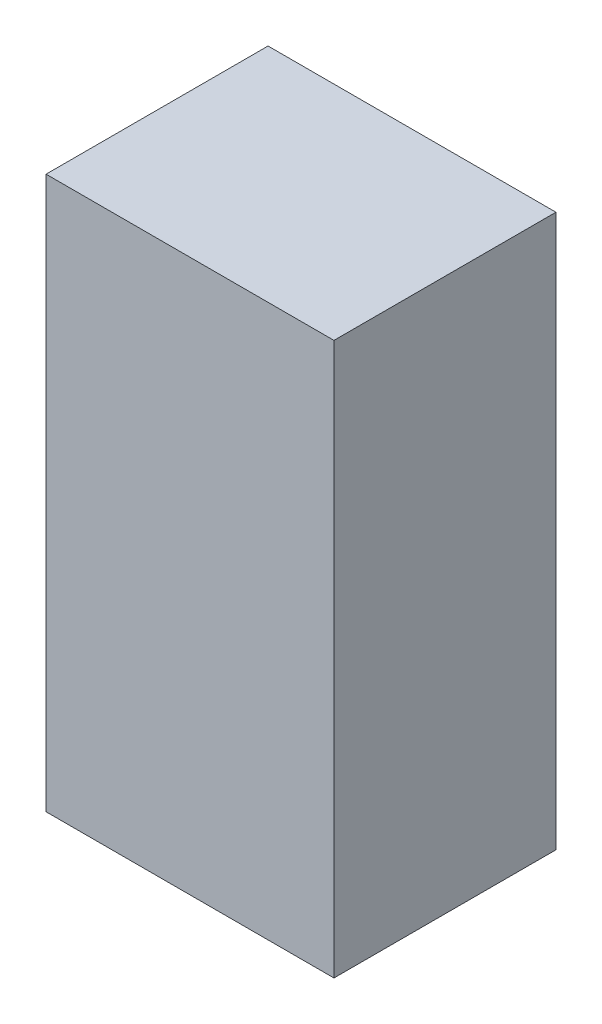
ISO-10303-21;
HEADER;
FILE_DESCRIPTION(('STEP AP214'),'2;1');
FILE_NAME('part.step','',(''),(''),'','','');
FILE_SCHEMA(('AUTOMOTIVE_DESIGN { 1 0 10303 214 1 1 1 1 }'));
ENDSEC;
DATA;
#1=APPLICATION_CONTEXT('core data for automotive mechanical design processes');
#2=APPLICATION_PROTOCOL_DEFINITION('international standard','automotive_design',2000,#1);
#3=PRODUCT_CONTEXT('',#1,'mechanical');
#4=PRODUCT('Part','Part','',(#3));
#5=PRODUCT_RELATED_PRODUCT_CATEGORY('part','',(#4));
#6=PRODUCT_DEFINITION_FORMATION('','',#4);
#7=PRODUCT_DEFINITION_CONTEXT('part definition',#1,'design');
#8=PRODUCT_DEFINITION('design','',#6,#7);
#9=PRODUCT_DEFINITION_SHAPE('','',#8);
#10=(LENGTH_UNIT() NAMED_UNIT(*) SI_UNIT(.MILLI.,.METRE.));
#11=(NAMED_UNIT(*) PLANE_ANGLE_UNIT() SI_UNIT($,.RADIAN.));
#12=(NAMED_UNIT(*) SI_UNIT($,.STERADIAN.) SOLID_ANGLE_UNIT());
#13=UNCERTAINTY_MEASURE_WITH_UNIT(LENGTH_MEASURE(1.E-05),#10,'distance_accuracy_value','');
#14=(GEOMETRIC_REPRESENTATION_CONTEXT(3) GLOBAL_UNCERTAINTY_ASSIGNED_CONTEXT((#13)) GLOBAL_UNIT_ASSIGNED_CONTEXT((#10,
#11,#12)) REPRESENTATION_CONTEXT('',''));
#15=CARTESIAN_POINT('',(0.,0.,0.));
#16=DIRECTION('',(0.,0.,1.));
#17=DIRECTION('',(1.,0.,0.));
#18=AXIS2_PLACEMENT_3D('',#15,#16,#17);
#19=CARTESIAN_POINT('',(0.,1300.,-261.293760943735));
#20=DIRECTION('',(0.,0.,-1.));
#21=DIRECTION('',(-1.,0.,0.));
#22=AXIS2_PLACEMENT_3D('',#19,#20,#21);
#23=PLANE('',#22);
#24=DIRECTION('',(1.,0.,0.));
#25=VECTOR('',#24,1.);
#26=CARTESIAN_POINT('',(0.,0.,-261.293760943735));
#27=LINE('',#26,#25);
#28=CARTESIAN_POINT('',(-338.872426258635,0.,-261.293760943735));
#29=VERTEX_POINT('',#28);
#30=CARTESIAN_POINT('',(338.872426258635,0.,-261.293760943735));
#31=VERTEX_POINT('',#30);
#32=EDGE_CURVE('E122',#29,#31,#27,.T.);
#33=ORIENTED_EDGE('',*,*,#32,.F.);
#34=DIRECTION('',(0.,-1.,0.));
#35=VECTOR('',#34,1.);
#36=CARTESIAN_POINT('',(-338.872426258635,1300.,-261.293760943735));
#37=LINE('',#36,#35);
#38=CARTESIAN_POINT('',(-338.872426258635,1300.,-261.293760943735));
#39=VERTEX_POINT('',#38);
#40=EDGE_CURVE('E12',#39,#29,#37,.T.);
#41=ORIENTED_EDGE('',*,*,#40,.F.);
#42=DIRECTION('',(1.,0.,0.));
#43=VECTOR('',#42,1.);
#44=CARTESIAN_POINT('',(0.,1300.,-261.293760943735));
#45=LINE('',#44,#43);
#46=CARTESIAN_POINT('',(338.872426258635,1300.,-261.293760943735));
#47=VERTEX_POINT('',#46);
#48=EDGE_CURVE('E117',#39,#47,#45,.T.);
#49=ORIENTED_EDGE('',*,*,#48,.T.);
#50=DIRECTION('',(0.,-1.,0.));
#51=VECTOR('',#50,1.);
#52=CARTESIAN_POINT('',(338.872426258635,1300.,-261.293760943735));
#53=LINE('',#52,#51);
#54=EDGE_CURVE('E60',#47,#31,#53,.T.);
#55=ORIENTED_EDGE('',*,*,#54,.T.);
#56=EDGE_LOOP('',(#33,#41,#49,#55));
#57=FACE_BOUND('',#56,.T.);
#58=ADVANCED_FACE('F57',(#57),#23,.T.);
#59=CARTESIAN_POINT('',(-338.872426258635,1300.,0.));
#60=DIRECTION('',(1.,0.,0.));
#61=DIRECTION('',(0.,0.,-1.));
#62=AXIS2_PLACEMENT_3D('',#59,#60,#61);
#63=PLANE('',#62);
#64=DIRECTION('',(0.,0.,1.));
#65=VECTOR('',#64,1.);
#66=CARTESIAN_POINT('',(-338.872426258635,0.,0.));
#67=LINE('',#66,#65);
#68=CARTESIAN_POINT('',(-338.872426258635,0.,261.293760943735));
#69=VERTEX_POINT('',#68);
#70=EDGE_CURVE('E90',#29,#69,#67,.T.);
#71=ORIENTED_EDGE('',*,*,#70,.T.);
#72=DIRECTION('',(0.,-1.,0.));
#73=VECTOR('',#72,1.);
#74=CARTESIAN_POINT('',(-338.872426258635,1300.,261.293760943735));
#75=LINE('',#74,#73);
#76=CARTESIAN_POINT('',(-338.872426258635,1300.,261.293760943735));
#77=VERTEX_POINT('',#76);
#78=EDGE_CURVE('E66',#77,#69,#75,.T.);
#79=ORIENTED_EDGE('',*,*,#78,.F.);
#80=DIRECTION('',(0.,0.,1.));
#81=VECTOR('',#80,1.);
#82=CARTESIAN_POINT('',(-338.872426258635,1300.,0.));
#83=LINE('',#82,#81);
#84=EDGE_CURVE('E107',#39,#77,#83,.T.);
#85=ORIENTED_EDGE('',*,*,#84,.F.);
#86=ORIENTED_EDGE('',*,*,#40,.T.);
#87=EDGE_LOOP('',(#71,#79,#85,#86));
#88=FACE_BOUND('',#87,.T.);
#89=ADVANCED_FACE('F132',(#88),#63,.F.);
#90=CARTESIAN_POINT('',(0.,1300.,261.293760943735));
#91=DIRECTION('',(0.,0.,-1.));
#92=DIRECTION('',(-1.,0.,0.));
#93=AXIS2_PLACEMENT_3D('',#90,#91,#92);
#94=PLANE('',#93);
#95=DIRECTION('',(1.,0.,0.));
#96=VECTOR('',#95,1.);
#97=CARTESIAN_POINT('',(0.,0.,261.293760943735));
#98=LINE('',#97,#96);
#99=CARTESIAN_POINT('',(338.872426258635,0.,261.293760943735));
#100=VERTEX_POINT('',#99);
#101=EDGE_CURVE('E114',#69,#100,#98,.T.);
#102=ORIENTED_EDGE('',*,*,#101,.T.);
#103=DIRECTION('',(0.,-1.,0.));
#104=VECTOR('',#103,1.);
#105=CARTESIAN_POINT('',(338.872426258635,1300.,261.293760943735));
#106=LINE('',#105,#104);
#107=CARTESIAN_POINT('',(338.872426258635,1300.,261.293760943735));
#108=VERTEX_POINT('',#107);
#109=EDGE_CURVE('E111',#108,#100,#106,.T.);
#110=ORIENTED_EDGE('',*,*,#109,.F.);
#111=DIRECTION('',(1.,0.,0.));
#112=VECTOR('',#111,1.);
#113=CARTESIAN_POINT('',(0.,1300.,261.293760943735));
#114=LINE('',#113,#112);
#115=EDGE_CURVE('E102',#77,#108,#114,.T.);
#116=ORIENTED_EDGE('',*,*,#115,.F.);
#117=ORIENTED_EDGE('',*,*,#78,.T.);
#118=EDGE_LOOP('',(#102,#110,#116,#117));
#119=FACE_BOUND('',#118,.T.);
#120=ADVANCED_FACE('F112',(#119),#94,.F.);
#121=CARTESIAN_POINT('',(338.872426258635,1300.,0.));
#122=DIRECTION('',(1.,0.,0.));
#123=DIRECTION('',(0.,0.,-1.));
#124=AXIS2_PLACEMENT_3D('',#121,#122,#123);
#125=PLANE('',#124);
#126=DIRECTION('',(0.,0.,1.));
#127=VECTOR('',#126,1.);
#128=CARTESIAN_POINT('',(338.872426258635,0.,0.));
#129=LINE('',#128,#127);
#130=EDGE_CURVE('E125',#31,#100,#129,.T.);
#131=ORIENTED_EDGE('',*,*,#130,.F.);
#132=ORIENTED_EDGE('',*,*,#54,.F.);
#133=DIRECTION('',(0.,0.,1.));
#134=VECTOR('',#133,1.);
#135=CARTESIAN_POINT('',(338.872426258635,1300.,0.));
#136=LINE('',#135,#134);
#137=EDGE_CURVE('E106',#47,#108,#136,.T.);
#138=ORIENTED_EDGE('',*,*,#137,.T.);
#139=ORIENTED_EDGE('',*,*,#109,.T.);
#140=EDGE_LOOP('',(#131,#132,#138,#139));
#141=FACE_BOUND('',#140,.T.);
#142=ADVANCED_FACE('F116',(#141),#125,.T.);
#143=CARTESIAN_POINT('',(0.,1300.,0.));
#144=DIRECTION('',(0.,-1.,0.));
#145=DIRECTION('',(0.,0.,-1.));
#146=AXIS2_PLACEMENT_3D('',#143,#144,#145);
#147=PLANE('',#146);
#148=ORIENTED_EDGE('',*,*,#48,.F.);
#149=ORIENTED_EDGE('',*,*,#84,.T.);
#150=ORIENTED_EDGE('',*,*,#115,.T.);
#151=ORIENTED_EDGE('',*,*,#137,.F.);
#152=EDGE_LOOP('',(#148,#149,#150,#151));
#153=FACE_BOUND('',#152,.T.);
#154=ADVANCED_FACE('F105',(#153),#147,.F.);
#155=CARTESIAN_POINT('',(0.,0.,0.));
#156=DIRECTION('',(0.,-1.,0.));
#157=DIRECTION('',(0.,0.,-1.));
#158=AXIS2_PLACEMENT_3D('',#155,#156,#157);
#159=PLANE('',#158);
#160=ORIENTED_EDGE('',*,*,#32,.T.);
#161=ORIENTED_EDGE('',*,*,#130,.T.);
#162=ORIENTED_EDGE('',*,*,#101,.F.);
#163=ORIENTED_EDGE('',*,*,#70,.F.);
#164=EDGE_LOOP('',(#160,#161,#162,#163));
#165=FACE_BOUND('',#164,.T.);
#166=ADVANCED_FACE('F130',(#165),#159,.T.);
#167=CLOSED_SHELL('',(#58,#89,#120,#142,#154,#166));
#168=MANIFOLD_SOLID_BREP('B2',#167);
#169=CARTESIAN_POINT('',(3.79849771843405,30.0702943124558,-2.03340232874608));
#170=DIRECTION('',(-0.172009604805727,0.0237988542082163,-0.984807753012208));
#171=DIRECTION('',(-0.985086761934652,0.,0.17205833737748));
#172=AXIS2_PLACEMENT_3D('',#169,#170,#171);
#173=PLANE('',#172);
#174=DIRECTION('',(0.975514944534338,-0.134970009198789,-0.173648177666931));
#175=VECTOR('',#174,1.);
#176=CARTESIAN_POINT('',(11.381492002607,78.9318221143126,-2.17708465972366));
#177=LINE('',#176,#175);
#178=CARTESIAN_POINT('',(10.9294786085309,78.9943616502759,-2.09662325561893));
#179=VERTEX_POINT('',#178);
#180=CARTESIAN_POINT('',(25.9197965419814,76.9203356594835,-4.765));
#181=VERTEX_POINT('',#180);
#182=EDGE_CURVE('E191',#179,#181,#177,.T.);
#183=ORIENTED_EDGE('',*,*,#182,.T.);
#184=DIRECTION('',(-0.137052139146914,-0.990563834972414,0.));
#185=VECTOR('',#184,1.);
#186=CARTESIAN_POINT('',(19.1439760676194,27.9471291415336,-4.765));
#187=LINE('',#186,#185);
#188=CARTESIAN_POINT('',(22.4386722076498,51.7600142511842,-4.765));
#189=VERTEX_POINT('',#188);
#190=EDGE_CURVE('E301',#181,#189,#187,.T.);
#191=ORIENTED_EDGE('',*,*,#190,.T.);
#192=DIRECTION('',(-0.975514944534338,0.134970009198788,0.173648177666931));
#193=VECTOR('',#192,1.);
#194=CARTESIAN_POINT('',(7.09319385846442,53.8831794221064,-2.03340232874608));
#195=LINE('',#194,#193);
#196=CARTESIAN_POINT('',(7.44835427419923,53.8340402419766,-2.09662325561893));
#197=VERTEX_POINT('',#196);
#198=EDGE_CURVE('E321',#189,#197,#195,.T.);
#199=ORIENTED_EDGE('',*,*,#198,.T.);
#200=CARTESIAN_POINT('',(5.5602363326343,54.0952759076824,-1.76052564726348));
#201=VERTEX_POINT('',#200);
#202=EDGE_CURVE('E314',#197,#201,#195,.T.);
#203=ORIENTED_EDGE('',*,*,#202,.T.);
#204=DIRECTION('',(0.137052139146914,0.990563834972414,0.));
#205=VECTOR('',#204,1.);
#206=CARTESIAN_POINT('',(2.2655401926039,30.2823907980318,-1.76052564726348));
#207=LINE('',#206,#205);
#208=CARTESIAN_POINT('',(9.04136066696591,79.2555973159817,-1.76052564726348));
#209=VERTEX_POINT('',#208);
#210=EDGE_CURVE('E326',#201,#209,#207,.T.);
#211=ORIENTED_EDGE('',*,*,#210,.T.);
#212=DIRECTION('',(-0.975514944534338,0.134970009198789,0.173648177666931));
#213=VECTOR('',#212,1.);
#214=CARTESIAN_POINT('',(10.5743181927961,79.0435008304057,-2.03340232874608));
#215=LINE('',#214,#213);
#216=EDGE_CURVE('E311',#179,#209,#215,.T.);
#217=ORIENTED_EDGE('',*,*,#216,.F.);
#218=EDGE_LOOP('',(#183,#191,#199,#203,#211,#217));
#219=FACE_BOUND('',#218,.T.);
#220=ADVANCED_FACE('F182',(#219),#173,.T.);
#221=CARTESIAN_POINT('',(5.43774925223263,29.8434912318515,7.35181555746026));
#222=DIRECTION('',(-0.172009604805727,0.0237988542082164,-0.984807753012208));
#223=DIRECTION('',(-0.985086761934652,0.,0.17205833737748));
#224=AXIS2_PLACEMENT_3D('',#221,#222,#223);
#225=PLANE('',#224);
#226=DIRECTION('',(0.137052139146914,0.990563834972414,0.));
#227=VECTOR('',#226,1.);
#228=CARTESIAN_POINT('',(23.2645716083907,51.6457447053,4.765));
#229=LINE('',#228,#227);
#230=CARTESIAN_POINT('',(23.2645716083907,51.6457447052999,4.765));
#231=VERTEX_POINT('',#230);
#232=CARTESIAN_POINT('',(26.7456959427223,76.8060661135992,4.765));
#233=VERTEX_POINT('',#232);
#234=EDGE_CURVE('E205',#231,#233,#229,.T.);
#235=ORIENTED_EDGE('',*,*,#234,.T.);
#236=DIRECTION('',(-0.975514944534338,0.134970009198789,0.173648177666932));
#237=VECTOR('',#236,1.);
#238=CARTESIAN_POINT('',(12.2135697265946,78.8166977498014,7.35181555746026));
#239=LINE('',#238,#237);
#240=CARTESIAN_POINT('',(10.6806122007645,79.0287942353774,7.62469223894286));
#241=VERTEX_POINT('',#240);
#242=EDGE_CURVE('E312',#233,#241,#239,.T.);
#243=ORIENTED_EDGE('',*,*,#242,.T.);
#244=DIRECTION('',(0.137052139146914,0.990563834972414,0.));
#245=VECTOR('',#244,1.);
#246=CARTESIAN_POINT('',(3.90479172640249,30.0555877174275,7.62469223894286));
#247=LINE('',#246,#245);
#248=CARTESIAN_POINT('',(7.19948786643288,53.8684728270781,7.62469223894286));
#249=VERTEX_POINT('',#248);
#250=EDGE_CURVE('E315',#249,#241,#247,.T.);
#251=ORIENTED_EDGE('',*,*,#250,.F.);
#252=DIRECTION('',(-0.975514944534338,0.134970009198788,0.173648177666931));
#253=VECTOR('',#252,1.);
#254=CARTESIAN_POINT('',(8.732445392263,53.6563763415021,7.35181555746026));
#255=LINE('',#254,#253);
#256=EDGE_CURVE('E317',#231,#249,#255,.T.);
#257=ORIENTED_EDGE('',*,*,#256,.F.);
#258=EDGE_LOOP('',(#235,#243,#251,#257));
#259=FACE_BOUND('',#258,.T.);
#260=ADVANCED_FACE('F431',(#259),#225,.F.);
#261=CARTESIAN_POINT('',(0.,0.,-4.765));
#262=DIRECTION('',(0.,0.,-1.));
#263=DIRECTION('',(-1.,0.,0.));
#264=AXIS2_PLACEMENT_3D('',#261,#262,#263);
#265=PLANE('',#264);
#266=DIRECTION('',(0.581238193719096,-0.813733471206735,0.));
#267=VECTOR('',#266,1.);
#268=CARTESIAN_POINT('',(33.4606591615412,139.831077173842,-4.765));
#269=LINE('',#268,#267);
#270=CARTESIAN_POINT('',(69.84,88.9,-4.765));
#271=VERTEX_POINT('',#270);
#272=CARTESIAN_POINT('',(133.34,0.,-4.765));
#273=VERTEX_POINT('',#272);
#274=EDGE_CURVE('E355',#271,#273,#269,.T.);
#275=ORIENTED_EDGE('',*,*,#274,.T.);
#276=DIRECTION('',(1.,0.,0.));
#277=VECTOR('',#276,1.);
#278=CARTESIAN_POINT('',(0.,0.,-4.765));
#279=LINE('',#278,#277);
#280=CARTESIAN_POINT('',(0.,0.,-4.765));
#281=VERTEX_POINT('',#280);
#282=EDGE_CURVE('E377',#281,#273,#279,.T.);
#283=ORIENTED_EDGE('',*,*,#282,.F.);
#284=DIRECTION('',(-0.137052139146914,-0.990563834972414,0.));
#285=VECTOR('',#284,1.);
#286=CARTESIAN_POINT('',(0.,0.,-4.765));
#287=LINE('',#286,#285);
#288=CARTESIAN_POINT('',(7.44835427419923,53.8340402419766,-4.765));
#289=VERTEX_POINT('',#288);
#290=EDGE_CURVE('E373',#289,#281,#287,.T.);
#291=ORIENTED_EDGE('',*,*,#290,.F.);
#292=DIRECTION('',(0.990563834972414,-0.137052139146913,0.));
#293=VECTOR('',#292,1.);
#294=CARTESIAN_POINT('',(7.44835427419919,53.8340402419766,-4.765));
#295=LINE('',#294,#293);
#296=EDGE_CURVE('E332',#289,#189,#295,.T.);
#297=ORIENTED_EDGE('',*,*,#296,.T.);
#298=ORIENTED_EDGE('',*,*,#190,.F.);
#299=DIRECTION('',(0.990563834972414,-0.137052139146914,0.));
#300=VECTOR('',#299,1.);
#301=CARTESIAN_POINT('',(10.9294786085308,78.9943616502759,-4.765));
#302=LINE('',#301,#300);
#303=CARTESIAN_POINT('',(10.9294786085309,78.9943616502759,-4.765));
#304=VERTEX_POINT('',#303);
#305=EDGE_CURVE('E330',#304,#181,#302,.T.);
#306=ORIENTED_EDGE('',*,*,#305,.F.);
#307=CARTESIAN_POINT('',(12.3,88.9,-4.765));
#308=VERTEX_POINT('',#307);
#309=EDGE_CURVE('E374',#308,#304,#287,.T.);
#310=ORIENTED_EDGE('',*,*,#309,.F.);
#311=DIRECTION('',(-1.,0.,0.));
#312=VECTOR('',#311,1.);
#313=CARTESIAN_POINT('',(12.3,88.9,-4.765));
#314=LINE('',#313,#312);
#315=EDGE_CURVE('E379',#271,#308,#314,.T.);
#316=ORIENTED_EDGE('',*,*,#315,.F.);
#317=EDGE_LOOP('',(#275,#283,#291,#297,#298,#306,#310,#316));
#318=FACE_BOUND('',#317,.T.);
#319=ADVANCED_FACE('F412',(#318),#265,.T.);
#320=CARTESIAN_POINT('',(0.,0.,-4.765));
#321=DIRECTION('',(-0.990563834972414,0.137052139146914,0.));
#322=DIRECTION('',(-0.137052139146914,-0.990563834972414,0.));
#323=AXIS2_PLACEMENT_3D('',#320,#321,#322);
#324=PLANE('',#323);
#325=ORIENTED_EDGE('',*,*,#309,.T.);
#326=DIRECTION('',(0.,0.,1.));
#327=VECTOR('',#326,1.);
#328=CARTESIAN_POINT('',(10.9294786085309,78.9943616502759,-4.765));
#329=LINE('',#328,#327);
#330=EDGE_CURVE('E344',#304,#179,#329,.T.);
#331=ORIENTED_EDGE('',*,*,#330,.T.);
#332=CARTESIAN_POINT('',(10.9294786085309,78.9943616502759,4.765));
#333=VERTEX_POINT('',#332);
#334=EDGE_CURVE('E335',#179,#333,#329,.T.);
#335=ORIENTED_EDGE('',*,*,#334,.T.);
#336=DIRECTION('',(-0.137052139146914,-0.990563834972414,0.));
#337=VECTOR('',#336,1.);
#338=CARTESIAN_POINT('',(0.,0.,4.765));
#339=LINE('',#338,#337);
#340=CARTESIAN_POINT('',(12.3,88.9,4.765));
#341=VERTEX_POINT('',#340);
#342=EDGE_CURVE('E365',#341,#333,#339,.T.);
#343=ORIENTED_EDGE('',*,*,#342,.F.);
#344=DIRECTION('',(0.,0.,1.));
#345=VECTOR('',#344,1.);
#346=CARTESIAN_POINT('',(12.3,88.9,-4.765));
#347=LINE('',#346,#345);
#348=EDGE_CURVE('E382',#308,#341,#347,.T.);
#349=ORIENTED_EDGE('',*,*,#348,.F.);
#350=EDGE_LOOP('',(#325,#331,#335,#343,#349));
#351=FACE_BOUND('',#350,.T.);
#352=ADVANCED_FACE('F400',(#351),#324,.T.);
#353=DIRECTION('',(0.,0.,1.));
#354=VECTOR('',#353,1.);
#355=CARTESIAN_POINT('',(7.44835427419923,53.8340402419766,-4.765));
#356=LINE('',#355,#354);
#357=EDGE_CURVE('E339',#289,#197,#356,.T.);
#358=ORIENTED_EDGE('',*,*,#357,.F.);
#359=ORIENTED_EDGE('',*,*,#290,.T.);
#360=DIRECTION('',(0.,0.,1.));
#361=VECTOR('',#360,1.);
#362=CARTESIAN_POINT('',(0.,0.,-4.765));
#363=LINE('',#362,#361);
#364=CARTESIAN_POINT('',(0.,0.,4.765));
#365=VERTEX_POINT('',#364);
#366=EDGE_CURVE('E381',#281,#365,#363,.T.);
#367=ORIENTED_EDGE('',*,*,#366,.T.);
#368=CARTESIAN_POINT('',(7.44835427419923,53.8340402419766,4.765));
#369=VERTEX_POINT('',#368);
#370=EDGE_CURVE('E364',#369,#365,#339,.T.);
#371=ORIENTED_EDGE('',*,*,#370,.F.);
#372=EDGE_CURVE('E343',#197,#369,#356,.T.);
#373=ORIENTED_EDGE('',*,*,#372,.F.);
#374=EDGE_LOOP('',(#358,#359,#367,#371,#373));
#375=FACE_BOUND('',#374,.T.);
#376=ADVANCED_FACE('F184',(#375),#324,.T.);
#377=CARTESIAN_POINT('',(12.3,88.9,-4.765));
#378=DIRECTION('',(0.,1.,0.));
#379=DIRECTION('',(0.,0.,1.));
#380=AXIS2_PLACEMENT_3D('',#377,#378,#379);
#381=PLANE('',#380);
#382=DIRECTION('',(0.964059128190834,0.,-0.265687781713668));
#383=VECTOR('',#382,1.);
#384=CARTESIAN_POINT('',(53.318676734993,88.9,9.31815820461297));
#385=LINE('',#384,#383);
#386=CARTESIAN_POINT('',(69.84,88.9,4.765));
#387=VERTEX_POINT('',#386);
#388=CARTESIAN_POINT('',(87.13,88.9,0.));
#389=VERTEX_POINT('',#388);
#390=EDGE_CURVE('E357',#387,#389,#385,.T.);
#391=ORIENTED_EDGE('',*,*,#390,.T.);
#392=DIRECTION('',(-0.964059128190834,0.,-0.265687781713668));
#393=VECTOR('',#392,1.);
#394=CARTESIAN_POINT('',(53.318676734993,88.9,-9.31815820461297));
#395=LINE('',#394,#393);
#396=EDGE_CURVE('E352',#389,#271,#395,.T.);
#397=ORIENTED_EDGE('',*,*,#396,.T.);
#398=ORIENTED_EDGE('',*,*,#315,.T.);
#399=ORIENTED_EDGE('',*,*,#348,.T.);
#400=DIRECTION('',(-1.,0.,0.));
#401=VECTOR('',#400,1.);
#402=CARTESIAN_POINT('',(12.3,88.9,4.765));
#403=LINE('',#402,#401);
#404=EDGE_CURVE('E371',#387,#341,#403,.T.);
#405=ORIENTED_EDGE('',*,*,#404,.F.);
#406=EDGE_LOOP('',(#391,#397,#398,#399,#405));
#407=FACE_BOUND('',#406,.T.);
#408=ADVANCED_FACE('F407',(#407),#381,.T.);
#409=CARTESIAN_POINT('',(0.,0.,-4.765));
#410=DIRECTION('',(0.,-1.,0.));
#411=DIRECTION('',(0.,0.,-1.));
#412=AXIS2_PLACEMENT_3D('',#409,#410,#411);
#413=PLANE('',#412);
#414=DIRECTION('',(0.964059128190834,0.,-0.265687781713668));
#415=VECTOR('',#414,1.);
#416=CARTESIAN_POINT('',(150.63,0.,0.));
#417=LINE('',#416,#415);
#418=CARTESIAN_POINT('',(133.34,0.,4.765));
#419=VERTEX_POINT('',#418);
#420=CARTESIAN_POINT('',(150.63,0.,0.));
#421=VERTEX_POINT('',#420);
#422=EDGE_CURVE('E346',#419,#421,#417,.T.);
#423=ORIENTED_EDGE('',*,*,#422,.F.);
#424=DIRECTION('',(1.,0.,0.));
#425=VECTOR('',#424,1.);
#426=CARTESIAN_POINT('',(0.,0.,4.765));
#427=LINE('',#426,#425);
#428=EDGE_CURVE('E368',#365,#419,#427,.T.);
#429=ORIENTED_EDGE('',*,*,#428,.F.);
#430=ORIENTED_EDGE('',*,*,#366,.F.);
#431=ORIENTED_EDGE('',*,*,#282,.T.);
#432=DIRECTION('',(-0.964059128190834,0.,-0.265687781713668));
#433=VECTOR('',#432,1.);
#434=CARTESIAN_POINT('',(150.63,0.,0.));
#435=LINE('',#434,#433);
#436=EDGE_CURVE('E342',#421,#273,#435,.T.);
#437=ORIENTED_EDGE('',*,*,#436,.F.);
#438=EDGE_LOOP('',(#423,#429,#430,#431,#437));
#439=FACE_BOUND('',#438,.T.);
#440=ADVANCED_FACE('F460',(#439),#413,.T.);
#441=CARTESIAN_POINT('',(0.,0.,4.765));
#442=DIRECTION('',(0.,0.,-1.));
#443=DIRECTION('',(-1.,0.,0.));
#444=AXIS2_PLACEMENT_3D('',#441,#442,#443);
#445=PLANE('',#444);
#446=ORIENTED_EDGE('',*,*,#234,.F.);
#447=DIRECTION('',(0.990563834972414,-0.137052139146913,0.));
#448=VECTOR('',#447,1.);
#449=CARTESIAN_POINT('',(7.44835427419919,53.8340402419766,4.765));
#450=LINE('',#449,#448);
#451=EDGE_CURVE('E333',#369,#231,#450,.T.);
#452=ORIENTED_EDGE('',*,*,#451,.F.);
#453=ORIENTED_EDGE('',*,*,#370,.T.);
#454=ORIENTED_EDGE('',*,*,#428,.T.);
#455=DIRECTION('',(0.581238193719096,-0.813733471206735,0.));
#456=VECTOR('',#455,1.);
#457=CARTESIAN_POINT('',(33.4606591615412,139.831077173842,4.765));
#458=LINE('',#457,#456);
#459=EDGE_CURVE('E349',#387,#419,#458,.T.);
#460=ORIENTED_EDGE('',*,*,#459,.F.);
#461=ORIENTED_EDGE('',*,*,#404,.T.);
#462=ORIENTED_EDGE('',*,*,#342,.T.);
#463=DIRECTION('',(0.990563834972414,-0.137052139146914,0.));
#464=VECTOR('',#463,1.);
#465=CARTESIAN_POINT('',(10.9294786085308,78.9943616502759,4.765));
#466=LINE('',#465,#464);
#467=EDGE_CURVE('E329',#333,#233,#466,.T.);
#468=ORIENTED_EDGE('',*,*,#467,.T.);
#469=EDGE_LOOP('',(#446,#452,#453,#454,#460,#461,#462,#468));
#470=FACE_BOUND('',#469,.T.);
#471=ADVANCED_FACE('F403',(#470),#445,.F.);
#472=CARTESIAN_POINT('',(50.7506591615412,139.831077173842,0.));
#473=DIRECTION('',(-0.261028842296734,-0.186449173069096,-0.947153973412495));
#474=DIRECTION('',(-0.964059128190834,0.,0.265687781713668));
#475=AXIS2_PLACEMENT_3D('',#472,#473,#474);
#476=PLANE('',#475);
#477=ORIENTED_EDGE('',*,*,#459,.T.);
#478=ORIENTED_EDGE('',*,*,#422,.T.);
#479=DIRECTION('',(0.581238193719096,-0.813733471206735,0.));
#480=VECTOR('',#479,1.);
#481=CARTESIAN_POINT('',(50.7506591615412,139.831077173842,0.));
#482=LINE('',#481,#480);
#483=EDGE_CURVE('E356',#389,#421,#482,.T.);
#484=ORIENTED_EDGE('',*,*,#483,.F.);
#485=ORIENTED_EDGE('',*,*,#390,.F.);
#486=EDGE_LOOP('',(#477,#478,#484,#485));
#487=FACE_BOUND('',#486,.T.);
#488=ADVANCED_FACE('F464',(#487),#476,.F.);
#489=CARTESIAN_POINT('',(50.7506591615412,139.831077173842,0.));
#490=DIRECTION('',(-0.261028842296734,-0.186449173069096,0.947153973412495));
#491=DIRECTION('',(0.964059128190834,0.,0.265687781713668));
#492=AXIS2_PLACEMENT_3D('',#489,#490,#491);
#493=PLANE('',#492);
#494=ORIENTED_EDGE('',*,*,#483,.T.);
#495=ORIENTED_EDGE('',*,*,#436,.T.);
#496=ORIENTED_EDGE('',*,*,#274,.F.);
#497=ORIENTED_EDGE('',*,*,#396,.F.);
#498=EDGE_LOOP('',(#494,#495,#496,#497));
#499=FACE_BOUND('',#498,.T.);
#500=ADVANCED_FACE('F425',(#499),#493,.F.);
#501=CARTESIAN_POINT('',(7.44835427419919,53.8340402419766,-4.765));
#502=DIRECTION('',(-0.137052139146913,-0.990563834972414,0.));
#503=DIRECTION('',(0.990563834972414,-0.137052139146913,0.));
#504=AXIS2_PLACEMENT_3D('',#501,#502,#503);
#505=PLANE('',#504);
#506=ORIENTED_EDGE('',*,*,#357,.T.);
#507=ORIENTED_EDGE('',*,*,#198,.F.);
#508=ORIENTED_EDGE('',*,*,#296,.F.);
#509=EDGE_LOOP('',(#506,#507,#508));
#510=FACE_BOUND('',#509,.T.);
#511=ADVANCED_FACE('F416',(#510),#505,.F.);
#512=CARTESIAN_POINT('',(10.9294786085308,78.9943616502759,-4.765));
#513=DIRECTION('',(-0.137052139146914,-0.990563834972414,0.));
#514=DIRECTION('',(0.990563834972414,-0.137052139146914,0.));
#515=AXIS2_PLACEMENT_3D('',#512,#513,#514);
#516=PLANE('',#515);
#517=ORIENTED_EDGE('',*,*,#182,.F.);
#518=ORIENTED_EDGE('',*,*,#330,.F.);
#519=ORIENTED_EDGE('',*,*,#305,.T.);
#520=EDGE_LOOP('',(#517,#518,#519));
#521=FACE_BOUND('',#520,.T.);
#522=ADVANCED_FACE('F413',(#521),#516,.T.);
#523=CARTESIAN_POINT('',(7.44835427419919,53.8340402419766,-4.765));
#524=DIRECTION('',(-0.137052139146913,-0.990563834972414,0.));
#525=DIRECTION('',(0.990563834972414,-0.137052139146913,0.));
#526=AXIS2_PLACEMENT_3D('',#523,#524,#525);
#527=PLANE('',#526);
#528=ORIENTED_EDGE('',*,*,#202,.F.);
#529=ORIENTED_EDGE('',*,*,#372,.T.);
#530=ORIENTED_EDGE('',*,*,#451,.T.);
#531=ORIENTED_EDGE('',*,*,#256,.T.);
#532=DIRECTION('',(0.172009604805727,-0.0237988542082163,0.984807753012208));
#533=VECTOR('',#532,1.);
#534=CARTESIAN_POINT('',(5.91539674836908,54.0461367275526,0.272876681482568));
#535=LINE('',#534,#533);
#536=EDGE_CURVE('E310',#201,#249,#535,.T.);
#537=ORIENTED_EDGE('',*,*,#536,.F.);
#538=EDGE_LOOP('',(#528,#529,#530,#531,#537));
#539=FACE_BOUND('',#538,.T.);
#540=ADVANCED_FACE('F415',(#539),#527,.T.);
#541=CARTESIAN_POINT('',(10.9294786085308,78.9943616502759,0.));
#542=DIRECTION('',(-0.137052139146914,-0.990563834972414,0.));
#543=DIRECTION('',(0.990563834972414,-0.137052139146914,0.));
#544=AXIS2_PLACEMENT_3D('',#541,#542,#543);
#545=PLANE('',#544);
#546=ORIENTED_EDGE('',*,*,#334,.F.);
#547=ORIENTED_EDGE('',*,*,#216,.T.);
#548=DIRECTION('',(0.172009604805727,-0.023798854208216,0.984807753012208));
#549=VECTOR('',#548,1.);
#550=CARTESIAN_POINT('',(9.3965210827007,79.2064581358519,0.27287668148257));
#551=LINE('',#550,#549);
#552=EDGE_CURVE('E307',#209,#241,#551,.T.);
#553=ORIENTED_EDGE('',*,*,#552,.T.);
#554=ORIENTED_EDGE('',*,*,#242,.F.);
#555=ORIENTED_EDGE('',*,*,#467,.F.);
#556=EDGE_LOOP('',(#546,#547,#553,#554,#555));
#557=FACE_BOUND('',#556,.T.);
#558=ADVANCED_FACE('F395',(#557),#545,.F.);
#559=CARTESIAN_POINT('',(2.62070060833869,30.233251617902,0.27287668148257));
#560=DIRECTION('',(-0.975514944534338,0.134970009198789,0.173648177666932));
#561=DIRECTION('',(0.175251786866792,0.,0.984523646846533));
#562=AXIS2_PLACEMENT_3D('',#559,#560,#561);
#563=PLANE('',#562);
#564=ORIENTED_EDGE('',*,*,#210,.F.);
#565=ORIENTED_EDGE('',*,*,#536,.T.);
#566=ORIENTED_EDGE('',*,*,#250,.T.);
#567=ORIENTED_EDGE('',*,*,#552,.F.);
#568=EDGE_LOOP('',(#564,#565,#566,#567));
#569=FACE_BOUND('',#568,.T.);
#570=ADVANCED_FACE('F442',(#569),#563,.T.);
#571=CLOSED_SHELL('',(#220,#260,#319,#352,#376,#408,#440,#471,#488,#500,#511,#522,#540,#558,#570));
#572=CARTESIAN_POINT('',(5.43774925223263,29.8434912318515,7.35181555746026));
#573=DIRECTION('',(-0.172009604805727,0.0237988542082164,-0.984807753012208));
#574=DIRECTION('',(-0.985086761934652,0.,0.17205833737748));
#575=AXIS2_PLACEMENT_3D('',#572,#573,#574);
#576=PLANE('',#575);
#577=DIRECTION('',(-0.985095272476007,-0.00415556913281087,0.1719594004136));
#578=VECTOR('',#577,1.);
#579=CARTESIAN_POINT('',(53.9820423199122,51.4162500289789,-0.605755552934865));
#580=LINE('',#579,#578);
#581=CARTESIAN_POINT('',(26.3291659878577,51.2995979217873,4.22136337315594));
#582=VERTEX_POINT('',#581);
#583=CARTESIAN_POINT('',(25.783047559812,51.2972941518412,4.31669445438781));
#584=VERTEX_POINT('',#583);
#585=EDGE_CURVE('E55',#582,#584,#580,.T.);
#586=ORIENTED_EDGE('',*,*,#585,.F.);
#587=DIRECTION('',(-0.137052139146915,-0.990563834972414,0.));
#588=VECTOR('',#587,1.);
#589=CARTESIAN_POINT('',(18.8702410562244,-2.61084325074872,4.22136337315595));
#590=LINE('',#589,#588);
#591=CARTESIAN_POINT('',(26.3185953304237,51.2231969912279,4.22136337315595));
#592=VERTEX_POINT('',#591);
#593=EDGE_CURVE('E282',#582,#592,#590,.T.);
#594=ORIENTED_EDGE('',*,*,#593,.T.);
#595=DIRECTION('',(-0.975514944534338,0.13497000919879,0.173648177666931));
#596=VECTOR('',#595,1.);
#597=CARTESIAN_POINT('',(-83.2344500725946,66.3807049603744,23.7225373927684));
#598=LINE('',#597,#596);
#599=EDGE_CURVE('E299',#592,#584,#598,.T.);
#600=ORIENTED_EDGE('',*,*,#599,.T.);
#601=EDGE_LOOP('',(#586,#594,#600));
#602=FACE_BOUND('',#601,.T.);
#603=ADVANCED_FACE('F298',(#602),#576,.T.);
#604=DIRECTION('',(0.990563834972413,-0.137052139146915,0.));
#605=VECTOR('',#604,1.);
#606=CARTESIAN_POINT('',(-10.9129587694543,56.3744693807498,4.22136337315595));
#607=LINE('',#606,#605);
#608=CARTESIAN_POINT('',(25.766396734755,51.2995979217872,4.22136337315595));
#609=VERTEX_POINT('',#608);
#610=EDGE_CURVE('E287',#609,#592,#607,.T.);
#611=ORIENTED_EDGE('',*,*,#610,.F.);
#612=DIRECTION('',(0.172009604805727,-0.0237988542082163,0.984807753012208));
#613=VECTOR('',#612,1.);
#614=CARTESIAN_POINT('',(24.4989564417482,51.4749580523157,-3.03512110307248));
#615=LINE('',#614,#613);
#616=EDGE_CURVE('E292',#609,#584,#615,.T.);
#617=ORIENTED_EDGE('',*,*,#616,.T.);
#618=ORIENTED_EDGE('',*,*,#599,.F.);
#619=EDGE_LOOP('',(#611,#617,#618));
#620=FACE_BOUND('',#619,.T.);
#621=ADVANCED_FACE('F428',(#620),#505,.F.);
#622=CARTESIAN_POINT('',(53.255575665439,51.5167622882591,-4.765));
#623=DIRECTION('',(0.,0.999708130297819,0.0241589365751076));
#624=DIRECTION('',(0.,-0.0241589365751076,0.999708130297819));
#625=AXIS2_PLACEMENT_3D('',#622,#623,#624);
#626=PLANE('',#625);
#627=DIRECTION('',(1.,0.,0.));
#628=VECTOR('',#627,1.);
#629=CARTESIAN_POINT('',(-10.9129587694543,51.2995979217872,4.221363373156));
#630=LINE('',#629,#628);
#631=EDGE_CURVE('E285',#609,#582,#630,.T.);
#632=ORIENTED_EDGE('',*,*,#631,.T.);
#633=ORIENTED_EDGE('',*,*,#585,.T.);
#634=ORIENTED_EDGE('',*,*,#616,.F.);
#635=EDGE_LOOP('',(#632,#633,#634));
#636=FACE_BOUND('',#635,.T.);
#637=ADVANCED_FACE('F296',(#636),#626,.F.);
#638=CARTESIAN_POINT('',(-10.9129587694543,56.3744693807498,4.22136337315595));
#639=DIRECTION('',(0.,0.,-1.));
#640=DIRECTION('',(0.,1.,0.));
#641=AXIS2_PLACEMENT_3D('',#638,#639,#640);
#642=PLANE('',#641);
#643=ORIENTED_EDGE('',*,*,#631,.F.);
#644=ORIENTED_EDGE('',*,*,#610,.T.);
#645=ORIENTED_EDGE('',*,*,#593,.F.);
#646=EDGE_LOOP('',(#643,#644,#645));
#647=FACE_BOUND('',#646,.T.);
#648=ADVANCED_FACE('F284',(#647),#642,.F.);
#649=CLOSED_SHELL('',(#603,#621,#637,#648));
#650=ORIENTED_CLOSED_SHELL('',*,#649,.T.);
#651=BREP_WITH_VOIDS('B6',#571,(#650));
#652=ADVANCED_BREP_SHAPE_REPRESENTATION('',(#18,#168,#651),#14);
#653=SHAPE_DEFINITION_REPRESENTATION(#9,#652);
ENDSEC;
END-ISO-10303-21;
